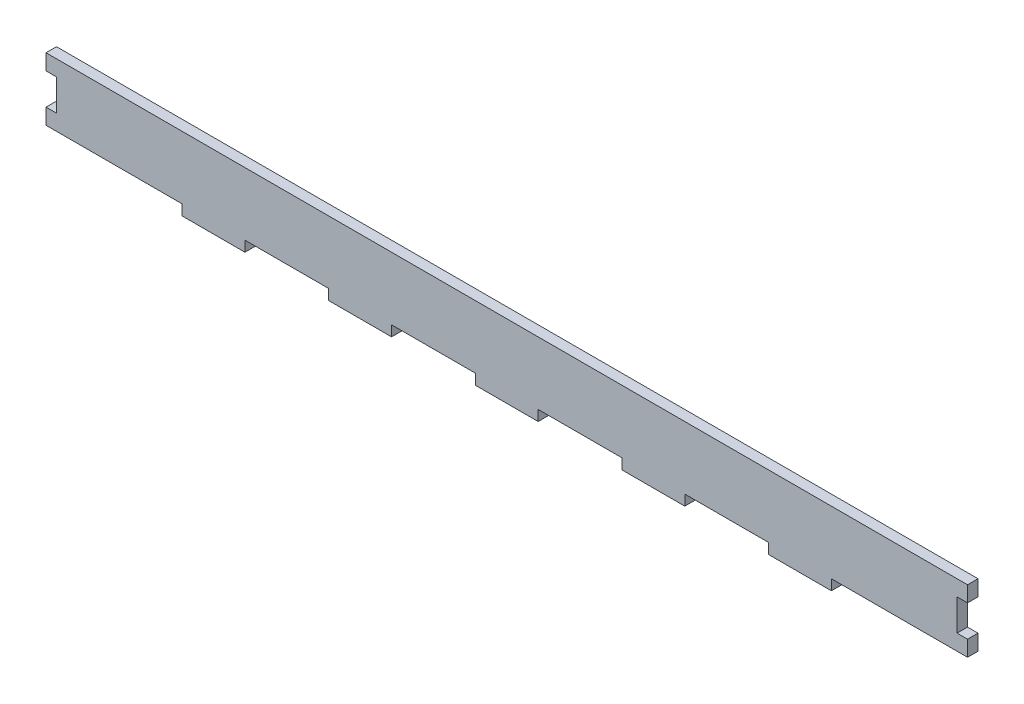
ISO-10303-21;
HEADER;
FILE_DESCRIPTION(('STEP AP214'),'2;1');
FILE_NAME('part.step','',(''),(''),'','','');
FILE_SCHEMA(('AUTOMOTIVE_DESIGN { 1 0 10303 214 1 1 1 1 }'));
ENDSEC;
DATA;
#1=APPLICATION_CONTEXT('core data for automotive mechanical design processes');
#2=APPLICATION_PROTOCOL_DEFINITION('international standard','automotive_design',2000,#1);
#3=PRODUCT_CONTEXT('',#1,'mechanical');
#4=PRODUCT('Part','Part','',(#3));
#5=PRODUCT_RELATED_PRODUCT_CATEGORY('part','',(#4));
#6=PRODUCT_DEFINITION_FORMATION('','',#4);
#7=PRODUCT_DEFINITION_CONTEXT('part definition',#1,'design');
#8=PRODUCT_DEFINITION('design','',#6,#7);
#9=PRODUCT_DEFINITION_SHAPE('','',#8);
#10=(LENGTH_UNIT() NAMED_UNIT(*) SI_UNIT(.MILLI.,.METRE.));
#11=(NAMED_UNIT(*) PLANE_ANGLE_UNIT() SI_UNIT($,.RADIAN.));
#12=(NAMED_UNIT(*) SI_UNIT($,.STERADIAN.) SOLID_ANGLE_UNIT());
#13=UNCERTAINTY_MEASURE_WITH_UNIT(LENGTH_MEASURE(1.E-05),#10,'distance_accuracy_value','');
#14=(GEOMETRIC_REPRESENTATION_CONTEXT(3) GLOBAL_UNCERTAINTY_ASSIGNED_CONTEXT((#13)) GLOBAL_UNIT_ASSIGNED_CONTEXT((#10,
#11,#12)) REPRESENTATION_CONTEXT('',''));
#15=CARTESIAN_POINT('',(0.,0.,0.));
#16=DIRECTION('',(0.,0.,1.));
#17=DIRECTION('',(1.,0.,0.));
#18=AXIS2_PLACEMENT_3D('',#15,#16,#17);
#19=CARTESIAN_POINT('',(9.99972860464549,0.,-5.));
#20=DIRECTION('',(1.,0.,0.));
#21=DIRECTION('',(0.,0.,-1.));
#22=AXIS2_PLACEMENT_3D('',#19,#20,#21);
#23=PLANE('',#22);
#24=DIRECTION('',(0.,1.,0.));
#25=VECTOR('',#24,1.);
#26=CARTESIAN_POINT('',(9.99972860464549,0.,0.));
#27=LINE('',#26,#25);
#28=CARTESIAN_POINT('',(9.99972860464549,-422.500000000006,0.));
#29=VERTEX_POINT('',#28);
#30=CARTESIAN_POINT('',(9.99972860464549,-407.500000000006,0.));
#31=VERTEX_POINT('',#30);
#32=EDGE_CURVE('E277',#29,#31,#27,.T.);
#33=ORIENTED_EDGE('',*,*,#32,.T.);
#34=DIRECTION('',(0.,0.,1.));
#35=VECTOR('',#34,1.);
#36=CARTESIAN_POINT('',(9.99972860464549,-407.500000000006,-5.));
#37=LINE('',#36,#35);
#38=CARTESIAN_POINT('',(9.99972860464549,-407.500000000006,-5.));
#39=VERTEX_POINT('',#38);
#40=EDGE_CURVE('E11',#39,#31,#37,.T.);
#41=ORIENTED_EDGE('',*,*,#40,.F.);
#42=DIRECTION('',(0.,1.,0.));
#43=VECTOR('',#42,1.);
#44=CARTESIAN_POINT('',(9.99972860464549,0.,-5.));
#45=LINE('',#44,#43);
#46=CARTESIAN_POINT('',(9.99972860464549,-422.500000000006,-5.));
#47=VERTEX_POINT('',#46);
#48=EDGE_CURVE('E354',#47,#39,#45,.T.);
#49=ORIENTED_EDGE('',*,*,#48,.F.);
#50=DIRECTION('',(0.,0.,1.));
#51=VECTOR('',#50,1.);
#52=CARTESIAN_POINT('',(9.99972860464549,-422.500000000006,-5.));
#53=LINE('',#52,#51);
#54=EDGE_CURVE('E42',#47,#29,#53,.T.);
#55=ORIENTED_EDGE('',*,*,#54,.T.);
#56=EDGE_LOOP('',(#33,#41,#49,#55));
#57=FACE_BOUND('',#56,.T.);
#58=ADVANCED_FACE('F39',(#57),#23,.F.);
#59=CARTESIAN_POINT('',(4.52440440576956E-12,-407.500000000006,-5.));
#60=DIRECTION('',(0.,1.,0.));
#61=DIRECTION('',(-1.,0.,0.));
#62=AXIS2_PLACEMENT_3D('',#59,#60,#61);
#63=PLANE('',#62);
#64=DIRECTION('',(-1.,0.,0.));
#65=VECTOR('',#64,1.);
#66=CARTESIAN_POINT('',(4.52440440576956E-12,-407.500000000006,0.));
#67=LINE('',#66,#65);
#68=CARTESIAN_POINT('',(4.99999999994966,-407.500000000006,0.));
#69=VERTEX_POINT('',#68);
#70=EDGE_CURVE('E162',#31,#69,#67,.T.);
#71=ORIENTED_EDGE('',*,*,#70,.T.);
#72=DIRECTION('',(0.,0.,1.));
#73=VECTOR('',#72,1.);
#74=CARTESIAN_POINT('',(4.99999999994966,-407.500000000006,-5.));
#75=LINE('',#74,#73);
#76=CARTESIAN_POINT('',(4.99999999994966,-407.500000000006,-5.));
#77=VERTEX_POINT('',#76);
#78=EDGE_CURVE('E48',#77,#69,#75,.T.);
#79=ORIENTED_EDGE('',*,*,#78,.F.);
#80=DIRECTION('',(-1.,0.,0.));
#81=VECTOR('',#80,1.);
#82=CARTESIAN_POINT('',(4.52440440576956E-12,-407.500000000006,-5.));
#83=LINE('',#82,#81);
#84=EDGE_CURVE('E56',#39,#77,#83,.T.);
#85=ORIENTED_EDGE('',*,*,#84,.F.);
#86=ORIENTED_EDGE('',*,*,#40,.T.);
#87=EDGE_LOOP('',(#71,#79,#85,#86));
#88=FACE_BOUND('',#87,.T.);
#89=ADVANCED_FACE('F441',(#88),#63,.F.);
#90=CARTESIAN_POINT('',(4.99999999994966,0.,-5.));
#91=DIRECTION('',(-1.,0.,0.));
#92=DIRECTION('',(0.,0.,1.));
#93=AXIS2_PLACEMENT_3D('',#90,#91,#92);
#94=PLANE('',#93);
#95=DIRECTION('',(0.,-1.,0.));
#96=VECTOR('',#95,1.);
#97=CARTESIAN_POINT('',(4.99999999994966,0.,0.));
#98=LINE('',#97,#96);
#99=CARTESIAN_POINT('',(4.99999999994966,-400.000000000006,0.));
#100=VERTEX_POINT('',#99);
#101=EDGE_CURVE('E259',#100,#69,#98,.T.);
#102=ORIENTED_EDGE('',*,*,#101,.F.);
#103=DIRECTION('',(0.,0.,1.));
#104=VECTOR('',#103,1.);
#105=CARTESIAN_POINT('',(4.99999999994966,-400.000000000006,-5.));
#106=LINE('',#105,#104);
#107=CARTESIAN_POINT('',(4.99999999994966,-400.000000000006,-5.));
#108=VERTEX_POINT('',#107);
#109=EDGE_CURVE('E254',#108,#100,#106,.T.);
#110=ORIENTED_EDGE('',*,*,#109,.F.);
#111=DIRECTION('',(0.,-1.,0.));
#112=VECTOR('',#111,1.);
#113=CARTESIAN_POINT('',(4.99999999994966,0.,-5.));
#114=LINE('',#113,#112);
#115=EDGE_CURVE('E258',#108,#77,#114,.T.);
#116=ORIENTED_EDGE('',*,*,#115,.T.);
#117=ORIENTED_EDGE('',*,*,#78,.T.);
#118=EDGE_LOOP('',(#102,#110,#116,#117));
#119=FACE_BOUND('',#118,.T.);
#120=ADVANCED_FACE('F256',(#119),#94,.T.);
#121=CARTESIAN_POINT('',(0.,-400.000000000006,-5.));
#122=DIRECTION('',(0.,-1.,0.));
#123=DIRECTION('',(0.,0.,-1.));
#124=AXIS2_PLACEMENT_3D('',#121,#122,#123);
#125=PLANE('',#124);
#126=DIRECTION('',(1.,0.,0.));
#127=VECTOR('',#126,1.);
#128=CARTESIAN_POINT('',(0.,-400.000000000006,0.));
#129=LINE('',#128,#127);
#130=CARTESIAN_POINT('',(445.00000000005,-400.000000000006,0.));
#131=VERTEX_POINT('',#130);
#132=EDGE_CURVE('E351',#100,#131,#129,.T.);
#133=ORIENTED_EDGE('',*,*,#132,.T.);
#134=DIRECTION('',(0.,0.,1.));
#135=VECTOR('',#134,1.);
#136=CARTESIAN_POINT('',(445.00000000005,-400.000000000006,-5.));
#137=LINE('',#136,#135);
#138=CARTESIAN_POINT('',(445.00000000005,-400.000000000006,-5.));
#139=VERTEX_POINT('',#138);
#140=EDGE_CURVE('E262',#139,#131,#137,.T.);
#141=ORIENTED_EDGE('',*,*,#140,.F.);
#142=DIRECTION('',(1.,0.,0.));
#143=VECTOR('',#142,1.);
#144=CARTESIAN_POINT('',(0.,-400.000000000006,-5.));
#145=LINE('',#144,#143);
#146=EDGE_CURVE('E265',#108,#139,#145,.T.);
#147=ORIENTED_EDGE('',*,*,#146,.F.);
#148=ORIENTED_EDGE('',*,*,#109,.T.);
#149=EDGE_LOOP('',(#133,#141,#147,#148));
#150=FACE_BOUND('',#149,.T.);
#151=ADVANCED_FACE('F266',(#150),#125,.F.);
#152=CARTESIAN_POINT('',(445.000000000044,6.58732327944329E-12,-5.));
#153=DIRECTION('',(-1.,0.,0.));
#154=DIRECTION('',(0.,-1.,0.));
#155=AXIS2_PLACEMENT_3D('',#152,#153,#154);
#156=PLANE('',#155);
#157=DIRECTION('',(0.,-1.,0.));
#158=VECTOR('',#157,1.);
#159=CARTESIAN_POINT('',(445.000000000044,6.58732327944329E-12,0.));
#160=LINE('',#159,#158);
#161=CARTESIAN_POINT('',(445.00000000005,-407.500000000006,0.));
#162=VERTEX_POINT('',#161);
#163=EDGE_CURVE('E348',#131,#162,#160,.T.);
#164=ORIENTED_EDGE('',*,*,#163,.T.);
#165=DIRECTION('',(0.,0.,1.));
#166=VECTOR('',#165,1.);
#167=CARTESIAN_POINT('',(445.00000000005,-407.500000000006,-5.));
#168=LINE('',#167,#166);
#169=CARTESIAN_POINT('',(445.00000000005,-407.500000000006,-5.));
#170=VERTEX_POINT('',#169);
#171=EDGE_CURVE('E358',#170,#162,#168,.T.);
#172=ORIENTED_EDGE('',*,*,#171,.F.);
#173=DIRECTION('',(0.,-1.,0.));
#174=VECTOR('',#173,1.);
#175=CARTESIAN_POINT('',(445.000000000044,6.58732327944329E-12,-5.));
#176=LINE('',#175,#174);
#177=EDGE_CURVE('E270',#139,#170,#176,.T.);
#178=ORIENTED_EDGE('',*,*,#177,.F.);
#179=ORIENTED_EDGE('',*,*,#140,.T.);
#180=EDGE_LOOP('',(#164,#172,#178,#179));
#181=FACE_BOUND('',#180,.T.);
#182=ADVANCED_FACE('F454',(#181),#156,.F.);
#183=CARTESIAN_POINT('',(-4.5244044057695E-12,-407.500000000001,-5.));
#184=DIRECTION('',(0.,-1.,0.));
#185=DIRECTION('',(1.,0.,0.));
#186=AXIS2_PLACEMENT_3D('',#183,#184,#185);
#187=PLANE('',#186);
#188=DIRECTION('',(1.,0.,0.));
#189=VECTOR('',#188,1.);
#190=CARTESIAN_POINT('',(-4.5244044057695E-12,-407.500000000001,0.));
#191=LINE('',#190,#189);
#192=CARTESIAN_POINT('',(440.000271395355,-407.500000000006,0.));
#193=VERTEX_POINT('',#192);
#194=EDGE_CURVE('E345',#193,#162,#191,.T.);
#195=ORIENTED_EDGE('',*,*,#194,.F.);
#196=DIRECTION('',(0.,0.,1.));
#197=VECTOR('',#196,1.);
#198=CARTESIAN_POINT('',(440.000271395355,-407.500000000006,-5.));
#199=LINE('',#198,#197);
#200=CARTESIAN_POINT('',(440.000271395355,-407.500000000006,-5.));
#201=VERTEX_POINT('',#200);
#202=EDGE_CURVE('E360',#201,#193,#199,.T.);
#203=ORIENTED_EDGE('',*,*,#202,.F.);
#204=DIRECTION('',(1.,0.,0.));
#205=VECTOR('',#204,1.);
#206=CARTESIAN_POINT('',(-4.5244044057695E-12,-407.500000000001,-5.));
#207=LINE('',#206,#205);
#208=EDGE_CURVE('E623',#201,#170,#207,.T.);
#209=ORIENTED_EDGE('',*,*,#208,.T.);
#210=ORIENTED_EDGE('',*,*,#171,.T.);
#211=EDGE_LOOP('',(#195,#203,#209,#210));
#212=FACE_BOUND('',#211,.T.);
#213=ADVANCED_FACE('F457',(#212),#187,.T.);
#214=CARTESIAN_POINT('',(440.000271395355,0.,-5.));
#215=DIRECTION('',(1.,0.,0.));
#216=DIRECTION('',(0.,0.,-1.));
#217=AXIS2_PLACEMENT_3D('',#214,#215,#216);
#218=PLANE('',#217);
#219=DIRECTION('',(0.,1.,0.));
#220=VECTOR('',#219,1.);
#221=CARTESIAN_POINT('',(440.000271395355,0.,0.));
#222=LINE('',#221,#220);
#223=CARTESIAN_POINT('',(440.000271395355,-422.500000000006,0.));
#224=VERTEX_POINT('',#223);
#225=EDGE_CURVE('E342',#224,#193,#222,.T.);
#226=ORIENTED_EDGE('',*,*,#225,.F.);
#227=DIRECTION('',(0.,0.,1.));
#228=VECTOR('',#227,1.);
#229=CARTESIAN_POINT('',(440.000271395355,-422.500000000006,-5.));
#230=LINE('',#229,#228);
#231=CARTESIAN_POINT('',(440.000271395355,-422.500000000006,-5.));
#232=VERTEX_POINT('',#231);
#233=EDGE_CURVE('E362',#232,#224,#230,.T.);
#234=ORIENTED_EDGE('',*,*,#233,.F.);
#235=DIRECTION('',(0.,1.,0.));
#236=VECTOR('',#235,1.);
#237=CARTESIAN_POINT('',(440.000271395355,0.,-5.));
#238=LINE('',#237,#236);
#239=EDGE_CURVE('E620',#232,#201,#238,.T.);
#240=ORIENTED_EDGE('',*,*,#239,.T.);
#241=ORIENTED_EDGE('',*,*,#202,.T.);
#242=EDGE_LOOP('',(#226,#234,#240,#241));
#243=FACE_BOUND('',#242,.T.);
#244=ADVANCED_FACE('F461',(#243),#218,.T.);
#245=CARTESIAN_POINT('',(0.,-422.500000000006,-5.));
#246=DIRECTION('',(0.,-1.,0.));
#247=DIRECTION('',(0.,0.,-1.));
#248=AXIS2_PLACEMENT_3D('',#245,#246,#247);
#249=PLANE('',#248);
#250=DIRECTION('',(1.,0.,0.));
#251=VECTOR('',#250,1.);
#252=CARTESIAN_POINT('',(0.,-422.500000000006,0.));
#253=LINE('',#252,#251);
#254=CARTESIAN_POINT('',(445.00000000005,-422.500000000006,0.));
#255=VERTEX_POINT('',#254);
#256=EDGE_CURVE('E340',#224,#255,#253,.T.);
#257=ORIENTED_EDGE('',*,*,#256,.T.);
#258=DIRECTION('',(0.,0.,1.));
#259=VECTOR('',#258,1.);
#260=CARTESIAN_POINT('',(445.00000000005,-422.500000000006,-5.));
#261=LINE('',#260,#259);
#262=CARTESIAN_POINT('',(445.00000000005,-422.500000000006,-5.));
#263=VERTEX_POINT('',#262);
#264=EDGE_CURVE('E364',#263,#255,#261,.T.);
#265=ORIENTED_EDGE('',*,*,#264,.F.);
#266=DIRECTION('',(1.,0.,0.));
#267=VECTOR('',#266,1.);
#268=CARTESIAN_POINT('',(0.,-422.500000000006,-5.));
#269=LINE('',#268,#267);
#270=EDGE_CURVE('E618',#232,#263,#269,.T.);
#271=ORIENTED_EDGE('',*,*,#270,.F.);
#272=ORIENTED_EDGE('',*,*,#233,.T.);
#273=EDGE_LOOP('',(#257,#265,#271,#272));
#274=FACE_BOUND('',#273,.T.);
#275=ADVANCED_FACE('F465',(#274),#249,.F.);
#276=CARTESIAN_POINT('',(445.000000000025,2.63492931177836E-11,-5.));
#277=DIRECTION('',(-1.,0.,0.));
#278=DIRECTION('',(0.,-1.,0.));
#279=AXIS2_PLACEMENT_3D('',#276,#277,#278);
#280=PLANE('',#279);
#281=DIRECTION('',(0.,-1.,0.));
#282=VECTOR('',#281,1.);
#283=CARTESIAN_POINT('',(445.000000000025,2.63492931177836E-11,0.));
#284=LINE('',#283,#282);
#285=CARTESIAN_POINT('',(445.000000000051,-430.000000000002,0.));
#286=VERTEX_POINT('',#285);
#287=EDGE_CURVE('E338',#255,#286,#284,.T.);
#288=ORIENTED_EDGE('',*,*,#287,.T.);
#289=DIRECTION('',(0.,0.,1.));
#290=VECTOR('',#289,1.);
#291=CARTESIAN_POINT('',(445.000000000051,-430.000000000002,-5.));
#292=LINE('',#291,#290);
#293=CARTESIAN_POINT('',(445.000000000051,-430.000000000002,-5.));
#294=VERTEX_POINT('',#293);
#295=EDGE_CURVE('E367',#294,#286,#292,.T.);
#296=ORIENTED_EDGE('',*,*,#295,.F.);
#297=DIRECTION('',(0.,-1.,0.));
#298=VECTOR('',#297,1.);
#299=CARTESIAN_POINT('',(445.000000000025,2.63492931177836E-11,-5.));
#300=LINE('',#299,#298);
#301=EDGE_CURVE('E616',#263,#294,#300,.T.);
#302=ORIENTED_EDGE('',*,*,#301,.F.);
#303=ORIENTED_EDGE('',*,*,#264,.T.);
#304=EDGE_LOOP('',(#288,#296,#302,#303));
#305=FACE_BOUND('',#304,.T.);
#306=ADVANCED_FACE('F469',(#305),#280,.F.);
#307=CARTESIAN_POINT('',(0.,-430.000000000006,-5.));
#308=DIRECTION('',(0.,1.,0.));
#309=DIRECTION('',(0.,0.,1.));
#310=AXIS2_PLACEMENT_3D('',#307,#308,#309);
#311=PLANE('',#310);
#312=DIRECTION('',(-1.,0.,0.));
#313=VECTOR('',#312,1.);
#314=CARTESIAN_POINT('',(0.,-430.000000000006,0.));
#315=LINE('',#314,#313);
#316=CARTESIAN_POINT('',(380.,-430.000000000006,0.));
#317=VERTEX_POINT('',#316);
#318=EDGE_CURVE('E336',#286,#317,#315,.T.);
#319=ORIENTED_EDGE('',*,*,#318,.T.);
#320=DIRECTION('',(0.,0.,1.));
#321=VECTOR('',#320,1.);
#322=CARTESIAN_POINT('',(380.,-430.000000000006,-5.));
#323=LINE('',#322,#321);
#324=CARTESIAN_POINT('',(380.,-430.000000000006,-5.));
#325=VERTEX_POINT('',#324);
#326=EDGE_CURVE('E370',#325,#317,#323,.T.);
#327=ORIENTED_EDGE('',*,*,#326,.F.);
#328=DIRECTION('',(-1.,0.,0.));
#329=VECTOR('',#328,1.);
#330=CARTESIAN_POINT('',(0.,-430.000000000006,-5.));
#331=LINE('',#330,#329);
#332=EDGE_CURVE('E614',#294,#325,#331,.T.);
#333=ORIENTED_EDGE('',*,*,#332,.F.);
#334=ORIENTED_EDGE('',*,*,#295,.T.);
#335=EDGE_LOOP('',(#319,#327,#333,#334));
#336=FACE_BOUND('',#335,.T.);
#337=ADVANCED_FACE('F473',(#336),#311,.F.);
#338=CARTESIAN_POINT('',(380.,0.,-5.));
#339=DIRECTION('',(-1.,0.,0.));
#340=DIRECTION('',(0.,0.,1.));
#341=AXIS2_PLACEMENT_3D('',#338,#339,#340);
#342=PLANE('',#341);
#343=DIRECTION('',(0.,-1.,0.));
#344=VECTOR('',#343,1.);
#345=CARTESIAN_POINT('',(380.,0.,0.));
#346=LINE('',#345,#344);
#347=CARTESIAN_POINT('',(380.,-435.,0.));
#348=VERTEX_POINT('',#347);
#349=EDGE_CURVE('E334',#317,#348,#346,.T.);
#350=ORIENTED_EDGE('',*,*,#349,.T.);
#351=DIRECTION('',(0.,0.,1.));
#352=VECTOR('',#351,1.);
#353=CARTESIAN_POINT('',(380.,-435.,-5.));
#354=LINE('',#353,#352);
#355=CARTESIAN_POINT('',(380.,-435.,-5.));
#356=VERTEX_POINT('',#355);
#357=EDGE_CURVE('E373',#356,#348,#354,.T.);
#358=ORIENTED_EDGE('',*,*,#357,.F.);
#359=DIRECTION('',(0.,-1.,0.));
#360=VECTOR('',#359,1.);
#361=CARTESIAN_POINT('',(380.,0.,-5.));
#362=LINE('',#361,#360);
#363=EDGE_CURVE('E612',#325,#356,#362,.T.);
#364=ORIENTED_EDGE('',*,*,#363,.F.);
#365=ORIENTED_EDGE('',*,*,#326,.T.);
#366=EDGE_LOOP('',(#350,#358,#364,#365));
#367=FACE_BOUND('',#366,.T.);
#368=ADVANCED_FACE('F477',(#367),#342,.F.);
#369=CARTESIAN_POINT('',(1.60982338570648E-12,-435.000000000001,-5.));
#370=DIRECTION('',(0.,1.,0.));
#371=DIRECTION('',(-1.,0.,0.));
#372=AXIS2_PLACEMENT_3D('',#369,#370,#371);
#373=PLANE('',#372);
#374=DIRECTION('',(-1.,0.,0.));
#375=VECTOR('',#374,1.);
#376=CARTESIAN_POINT('',(1.60982338570648E-12,-435.000000000001,0.));
#377=LINE('',#376,#375);
#378=CARTESIAN_POINT('',(350.,-435.,0.));
#379=VERTEX_POINT('',#378);
#380=EDGE_CURVE('E331',#348,#379,#377,.T.);
#381=ORIENTED_EDGE('',*,*,#380,.T.);
#382=DIRECTION('',(0.,0.,1.));
#383=VECTOR('',#382,1.);
#384=CARTESIAN_POINT('',(350.,-435.,-5.));
#385=LINE('',#384,#383);
#386=CARTESIAN_POINT('',(350.,-435.,-5.));
#387=VERTEX_POINT('',#386);
#388=EDGE_CURVE('E376',#387,#379,#385,.T.);
#389=ORIENTED_EDGE('',*,*,#388,.F.);
#390=DIRECTION('',(-1.,0.,0.));
#391=VECTOR('',#390,1.);
#392=CARTESIAN_POINT('',(1.60982338570648E-12,-435.000000000001,-5.));
#393=LINE('',#392,#391);
#394=EDGE_CURVE('E610',#356,#387,#393,.T.);
#395=ORIENTED_EDGE('',*,*,#394,.F.);
#396=ORIENTED_EDGE('',*,*,#357,.T.);
#397=EDGE_LOOP('',(#381,#389,#395,#396));
#398=FACE_BOUND('',#397,.T.);
#399=ADVANCED_FACE('F481',(#398),#373,.F.);
#400=CARTESIAN_POINT('',(350.,0.,-5.));
#401=DIRECTION('',(-1.,0.,0.));
#402=DIRECTION('',(0.,0.,1.));
#403=AXIS2_PLACEMENT_3D('',#400,#401,#402);
#404=PLANE('',#403);
#405=DIRECTION('',(0.,-1.,0.));
#406=VECTOR('',#405,1.);
#407=CARTESIAN_POINT('',(350.,0.,0.));
#408=LINE('',#407,#406);
#409=CARTESIAN_POINT('',(350.,-430.000000000006,0.));
#410=VERTEX_POINT('',#409);
#411=EDGE_CURVE('E328',#410,#379,#408,.T.);
#412=ORIENTED_EDGE('',*,*,#411,.F.);
#413=DIRECTION('',(0.,0.,1.));
#414=VECTOR('',#413,1.);
#415=CARTESIAN_POINT('',(350.,-430.000000000006,-5.));
#416=LINE('',#415,#414);
#417=CARTESIAN_POINT('',(350.,-430.000000000006,-5.));
#418=VERTEX_POINT('',#417);
#419=EDGE_CURVE('E378',#418,#410,#416,.T.);
#420=ORIENTED_EDGE('',*,*,#419,.F.);
#421=DIRECTION('',(0.,-1.,0.));
#422=VECTOR('',#421,1.);
#423=CARTESIAN_POINT('',(350.,0.,-5.));
#424=LINE('',#423,#422);
#425=EDGE_CURVE('E607',#418,#387,#424,.T.);
#426=ORIENTED_EDGE('',*,*,#425,.T.);
#427=ORIENTED_EDGE('',*,*,#388,.T.);
#428=EDGE_LOOP('',(#412,#420,#426,#427));
#429=FACE_BOUND('',#428,.T.);
#430=ADVANCED_FACE('F485',(#429),#404,.T.);
#431=CARTESIAN_POINT('',(-5.96744875736029E-13,-430.000000000005,-5.));
#432=DIRECTION('',(0.,1.,0.));
#433=DIRECTION('',(-1.,0.,0.));
#434=AXIS2_PLACEMENT_3D('',#431,#432,#433);
#435=PLANE('',#434);
#436=DIRECTION('',(-1.,0.,0.));
#437=VECTOR('',#436,1.);
#438=CARTESIAN_POINT('',(-5.96744875736029E-13,-430.000000000005,0.));
#439=LINE('',#438,#437);
#440=CARTESIAN_POINT('',(310.,-430.000000000006,0.));
#441=VERTEX_POINT('',#440);
#442=EDGE_CURVE('E326',#410,#441,#439,.T.);
#443=ORIENTED_EDGE('',*,*,#442,.T.);
#444=DIRECTION('',(0.,0.,1.));
#445=VECTOR('',#444,1.);
#446=CARTESIAN_POINT('',(310.,-430.000000000006,-5.));
#447=LINE('',#446,#445);
#448=CARTESIAN_POINT('',(310.,-430.000000000006,-5.));
#449=VERTEX_POINT('',#448);
#450=EDGE_CURVE('E380',#449,#441,#447,.T.);
#451=ORIENTED_EDGE('',*,*,#450,.F.);
#452=DIRECTION('',(-1.,0.,0.));
#453=VECTOR('',#452,1.);
#454=CARTESIAN_POINT('',(-5.96744875736029E-13,-430.000000000005,-5.));
#455=LINE('',#454,#453);
#456=EDGE_CURVE('E605',#418,#449,#455,.T.);
#457=ORIENTED_EDGE('',*,*,#456,.F.);
#458=ORIENTED_EDGE('',*,*,#419,.T.);
#459=EDGE_LOOP('',(#443,#451,#457,#458));
#460=FACE_BOUND('',#459,.T.);
#461=ADVANCED_FACE('F489',(#460),#435,.F.);
#462=CARTESIAN_POINT('',(310.,0.,-5.));
#463=DIRECTION('',(-1.,0.,0.));
#464=DIRECTION('',(0.,0.,1.));
#465=AXIS2_PLACEMENT_3D('',#462,#463,#464);
#466=PLANE('',#465);
#467=DIRECTION('',(0.,-1.,0.));
#468=VECTOR('',#467,1.);
#469=CARTESIAN_POINT('',(310.,0.,0.));
#470=LINE('',#469,#468);
#471=CARTESIAN_POINT('',(310.,-435.,0.));
#472=VERTEX_POINT('',#471);
#473=EDGE_CURVE('E324',#441,#472,#470,.T.);
#474=ORIENTED_EDGE('',*,*,#473,.T.);
#475=DIRECTION('',(0.,0.,1.));
#476=VECTOR('',#475,1.);
#477=CARTESIAN_POINT('',(310.,-435.,-5.));
#478=LINE('',#477,#476);
#479=CARTESIAN_POINT('',(310.,-435.,-5.));
#480=VERTEX_POINT('',#479);
#481=EDGE_CURVE('E383',#480,#472,#478,.T.);
#482=ORIENTED_EDGE('',*,*,#481,.F.);
#483=DIRECTION('',(0.,-1.,0.));
#484=VECTOR('',#483,1.);
#485=CARTESIAN_POINT('',(310.,0.,-5.));
#486=LINE('',#485,#484);
#487=EDGE_CURVE('E603',#449,#480,#486,.T.);
#488=ORIENTED_EDGE('',*,*,#487,.F.);
#489=ORIENTED_EDGE('',*,*,#450,.T.);
#490=EDGE_LOOP('',(#474,#482,#488,#489));
#491=FACE_BOUND('',#490,.T.);
#492=ADVANCED_FACE('F493',(#491),#466,.F.);
#493=CARTESIAN_POINT('',(1.60982338570648E-12,-435.000000000001,-5.));
#494=DIRECTION('',(0.,1.,0.));
#495=DIRECTION('',(-1.,0.,0.));
#496=AXIS2_PLACEMENT_3D('',#493,#494,#495);
#497=PLANE('',#496);
#498=DIRECTION('',(-1.,0.,0.));
#499=VECTOR('',#498,1.);
#500=CARTESIAN_POINT('',(1.60982338570648E-12,-435.000000000001,0.));
#501=LINE('',#500,#499);
#502=CARTESIAN_POINT('',(280.,-435.,0.));
#503=VERTEX_POINT('',#502);
#504=EDGE_CURVE('E321',#472,#503,#501,.T.);
#505=ORIENTED_EDGE('',*,*,#504,.T.);
#506=DIRECTION('',(0.,0.,1.));
#507=VECTOR('',#506,1.);
#508=CARTESIAN_POINT('',(280.,-435.,-5.));
#509=LINE('',#508,#507);
#510=CARTESIAN_POINT('',(280.,-435.,-5.));
#511=VERTEX_POINT('',#510);
#512=EDGE_CURVE('E386',#511,#503,#509,.T.);
#513=ORIENTED_EDGE('',*,*,#512,.F.);
#514=DIRECTION('',(-1.,0.,0.));
#515=VECTOR('',#514,1.);
#516=CARTESIAN_POINT('',(1.60982338570648E-12,-435.000000000001,-5.));
#517=LINE('',#516,#515);
#518=EDGE_CURVE('E601',#480,#511,#517,.T.);
#519=ORIENTED_EDGE('',*,*,#518,.F.);
#520=ORIENTED_EDGE('',*,*,#481,.T.);
#521=EDGE_LOOP('',(#505,#513,#519,#520));
#522=FACE_BOUND('',#521,.T.);
#523=ADVANCED_FACE('F497',(#522),#497,.F.);
#524=CARTESIAN_POINT('',(280.,0.,-5.));
#525=DIRECTION('',(-1.,0.,0.));
#526=DIRECTION('',(0.,0.,1.));
#527=AXIS2_PLACEMENT_3D('',#524,#525,#526);
#528=PLANE('',#527);
#529=DIRECTION('',(0.,-1.,0.));
#530=VECTOR('',#529,1.);
#531=CARTESIAN_POINT('',(280.,0.,0.));
#532=LINE('',#531,#530);
#533=CARTESIAN_POINT('',(280.,-430.000000000006,0.));
#534=VERTEX_POINT('',#533);
#535=EDGE_CURVE('E318',#534,#503,#532,.T.);
#536=ORIENTED_EDGE('',*,*,#535,.F.);
#537=DIRECTION('',(0.,0.,1.));
#538=VECTOR('',#537,1.);
#539=CARTESIAN_POINT('',(280.,-430.000000000006,-5.));
#540=LINE('',#539,#538);
#541=CARTESIAN_POINT('',(280.,-430.000000000006,-5.));
#542=VERTEX_POINT('',#541);
#543=EDGE_CURVE('E388',#542,#534,#540,.T.);
#544=ORIENTED_EDGE('',*,*,#543,.F.);
#545=DIRECTION('',(0.,-1.,0.));
#546=VECTOR('',#545,1.);
#547=CARTESIAN_POINT('',(280.,0.,-5.));
#548=LINE('',#547,#546);
#549=EDGE_CURVE('E598',#542,#511,#548,.T.);
#550=ORIENTED_EDGE('',*,*,#549,.T.);
#551=ORIENTED_EDGE('',*,*,#512,.T.);
#552=EDGE_LOOP('',(#536,#544,#550,#551));
#553=FACE_BOUND('',#552,.T.);
#554=ADVANCED_FACE('F501',(#553),#528,.T.);
#555=CARTESIAN_POINT('',(-5.96744875736029E-13,-430.000000000005,-5.));
#556=DIRECTION('',(0.,1.,0.));
#557=DIRECTION('',(-1.,0.,0.));
#558=AXIS2_PLACEMENT_3D('',#555,#556,#557);
#559=PLANE('',#558);
#560=DIRECTION('',(-1.,0.,0.));
#561=VECTOR('',#560,1.);
#562=CARTESIAN_POINT('',(-5.96744875736029E-13,-430.000000000005,0.));
#563=LINE('',#562,#561);
#564=CARTESIAN_POINT('',(240.,-430.000000000006,0.));
#565=VERTEX_POINT('',#564);
#566=EDGE_CURVE('E316',#534,#565,#563,.T.);
#567=ORIENTED_EDGE('',*,*,#566,.T.);
#568=DIRECTION('',(0.,0.,1.));
#569=VECTOR('',#568,1.);
#570=CARTESIAN_POINT('',(240.,-430.000000000006,-5.));
#571=LINE('',#570,#569);
#572=CARTESIAN_POINT('',(240.,-430.000000000006,-5.));
#573=VERTEX_POINT('',#572);
#574=EDGE_CURVE('E390',#573,#565,#571,.T.);
#575=ORIENTED_EDGE('',*,*,#574,.F.);
#576=DIRECTION('',(-1.,0.,0.));
#577=VECTOR('',#576,1.);
#578=CARTESIAN_POINT('',(-5.96744875736029E-13,-430.000000000005,-5.));
#579=LINE('',#578,#577);
#580=EDGE_CURVE('E596',#542,#573,#579,.T.);
#581=ORIENTED_EDGE('',*,*,#580,.F.);
#582=ORIENTED_EDGE('',*,*,#543,.T.);
#583=EDGE_LOOP('',(#567,#575,#581,#582));
#584=FACE_BOUND('',#583,.T.);
#585=ADVANCED_FACE('F505',(#584),#559,.F.);
#586=CARTESIAN_POINT('',(240.,0.,-5.));
#587=DIRECTION('',(-1.,0.,0.));
#588=DIRECTION('',(0.,0.,1.));
#589=AXIS2_PLACEMENT_3D('',#586,#587,#588);
#590=PLANE('',#589);
#591=DIRECTION('',(0.,-1.,0.));
#592=VECTOR('',#591,1.);
#593=CARTESIAN_POINT('',(240.,0.,0.));
#594=LINE('',#593,#592);
#595=CARTESIAN_POINT('',(240.,-435.,0.));
#596=VERTEX_POINT('',#595);
#597=EDGE_CURVE('E314',#565,#596,#594,.T.);
#598=ORIENTED_EDGE('',*,*,#597,.T.);
#599=DIRECTION('',(0.,0.,1.));
#600=VECTOR('',#599,1.);
#601=CARTESIAN_POINT('',(240.,-435.,-5.));
#602=LINE('',#601,#600);
#603=CARTESIAN_POINT('',(240.,-435.,-5.));
#604=VERTEX_POINT('',#603);
#605=EDGE_CURVE('E393',#604,#596,#602,.T.);
#606=ORIENTED_EDGE('',*,*,#605,.F.);
#607=DIRECTION('',(0.,-1.,0.));
#608=VECTOR('',#607,1.);
#609=CARTESIAN_POINT('',(240.,0.,-5.));
#610=LINE('',#609,#608);
#611=EDGE_CURVE('E594',#573,#604,#610,.T.);
#612=ORIENTED_EDGE('',*,*,#611,.F.);
#613=ORIENTED_EDGE('',*,*,#574,.T.);
#614=EDGE_LOOP('',(#598,#606,#612,#613));
#615=FACE_BOUND('',#614,.T.);
#616=ADVANCED_FACE('F509',(#615),#590,.F.);
#617=CARTESIAN_POINT('',(1.60982338570648E-12,-435.000000000001,-5.));
#618=DIRECTION('',(0.,1.,0.));
#619=DIRECTION('',(-1.,0.,0.));
#620=AXIS2_PLACEMENT_3D('',#617,#618,#619);
#621=PLANE('',#620);
#622=DIRECTION('',(-1.,0.,0.));
#623=VECTOR('',#622,1.);
#624=CARTESIAN_POINT('',(1.60982338570648E-12,-435.000000000001,0.));
#625=LINE('',#624,#623);
#626=CARTESIAN_POINT('',(210.,-435.,0.));
#627=VERTEX_POINT('',#626);
#628=EDGE_CURVE('E311',#596,#627,#625,.T.);
#629=ORIENTED_EDGE('',*,*,#628,.T.);
#630=DIRECTION('',(0.,0.,1.));
#631=VECTOR('',#630,1.);
#632=CARTESIAN_POINT('',(210.,-435.,-5.));
#633=LINE('',#632,#631);
#634=CARTESIAN_POINT('',(210.,-435.,-5.));
#635=VERTEX_POINT('',#634);
#636=EDGE_CURVE('E396',#635,#627,#633,.T.);
#637=ORIENTED_EDGE('',*,*,#636,.F.);
#638=DIRECTION('',(-1.,0.,0.));
#639=VECTOR('',#638,1.);
#640=CARTESIAN_POINT('',(1.60982338570648E-12,-435.000000000001,-5.));
#641=LINE('',#640,#639);
#642=EDGE_CURVE('E592',#604,#635,#641,.T.);
#643=ORIENTED_EDGE('',*,*,#642,.F.);
#644=ORIENTED_EDGE('',*,*,#605,.T.);
#645=EDGE_LOOP('',(#629,#637,#643,#644));
#646=FACE_BOUND('',#645,.T.);
#647=ADVANCED_FACE('F513',(#646),#621,.F.);
#648=CARTESIAN_POINT('',(210.,0.,-5.));
#649=DIRECTION('',(-1.,0.,0.));
#650=DIRECTION('',(0.,0.,1.));
#651=AXIS2_PLACEMENT_3D('',#648,#649,#650);
#652=PLANE('',#651);
#653=DIRECTION('',(0.,-1.,0.));
#654=VECTOR('',#653,1.);
#655=CARTESIAN_POINT('',(210.,0.,0.));
#656=LINE('',#655,#654);
#657=CARTESIAN_POINT('',(210.,-430.000000000006,0.));
#658=VERTEX_POINT('',#657);
#659=EDGE_CURVE('E308',#658,#627,#656,.T.);
#660=ORIENTED_EDGE('',*,*,#659,.F.);
#661=DIRECTION('',(0.,0.,1.));
#662=VECTOR('',#661,1.);
#663=CARTESIAN_POINT('',(210.,-430.000000000006,-5.));
#664=LINE('',#663,#662);
#665=CARTESIAN_POINT('',(210.,-430.000000000006,-5.));
#666=VERTEX_POINT('',#665);
#667=EDGE_CURVE('E398',#666,#658,#664,.T.);
#668=ORIENTED_EDGE('',*,*,#667,.F.);
#669=DIRECTION('',(0.,-1.,0.));
#670=VECTOR('',#669,1.);
#671=CARTESIAN_POINT('',(210.,0.,-5.));
#672=LINE('',#671,#670);
#673=EDGE_CURVE('E589',#666,#635,#672,.T.);
#674=ORIENTED_EDGE('',*,*,#673,.T.);
#675=ORIENTED_EDGE('',*,*,#636,.T.);
#676=EDGE_LOOP('',(#660,#668,#674,#675));
#677=FACE_BOUND('',#676,.T.);
#678=ADVANCED_FACE('F517',(#677),#652,.T.);
#679=CARTESIAN_POINT('',(-5.96744875736029E-13,-430.000000000006,-5.));
#680=DIRECTION('',(0.,1.,0.));
#681=DIRECTION('',(-1.,0.,0.));
#682=AXIS2_PLACEMENT_3D('',#679,#680,#681);
#683=PLANE('',#682);
#684=DIRECTION('',(-1.,0.,0.));
#685=VECTOR('',#684,1.);
#686=CARTESIAN_POINT('',(-5.96744875736029E-13,-430.000000000006,0.));
#687=LINE('',#686,#685);
#688=CARTESIAN_POINT('',(170.,-430.000000000006,0.));
#689=VERTEX_POINT('',#688);
#690=EDGE_CURVE('E306',#658,#689,#687,.T.);
#691=ORIENTED_EDGE('',*,*,#690,.T.);
#692=DIRECTION('',(0.,0.,1.));
#693=VECTOR('',#692,1.);
#694=CARTESIAN_POINT('',(170.,-430.000000000006,-5.));
#695=LINE('',#694,#693);
#696=CARTESIAN_POINT('',(170.,-430.000000000006,-5.));
#697=VERTEX_POINT('',#696);
#698=EDGE_CURVE('E400',#697,#689,#695,.T.);
#699=ORIENTED_EDGE('',*,*,#698,.F.);
#700=DIRECTION('',(-1.,0.,0.));
#701=VECTOR('',#700,1.);
#702=CARTESIAN_POINT('',(-5.96744875736029E-13,-430.000000000006,-5.));
#703=LINE('',#702,#701);
#704=EDGE_CURVE('E587',#666,#697,#703,.T.);
#705=ORIENTED_EDGE('',*,*,#704,.F.);
#706=ORIENTED_EDGE('',*,*,#667,.T.);
#707=EDGE_LOOP('',(#691,#699,#705,#706));
#708=FACE_BOUND('',#707,.T.);
#709=ADVANCED_FACE('F521',(#708),#683,.F.);
#710=CARTESIAN_POINT('',(170.,0.,-5.));
#711=DIRECTION('',(-1.,0.,0.));
#712=DIRECTION('',(0.,0.,1.));
#713=AXIS2_PLACEMENT_3D('',#710,#711,#712);
#714=PLANE('',#713);
#715=DIRECTION('',(0.,-1.,0.));
#716=VECTOR('',#715,1.);
#717=CARTESIAN_POINT('',(170.,0.,0.));
#718=LINE('',#717,#716);
#719=CARTESIAN_POINT('',(170.,-435.,0.));
#720=VERTEX_POINT('',#719);
#721=EDGE_CURVE('E304',#689,#720,#718,.T.);
#722=ORIENTED_EDGE('',*,*,#721,.T.);
#723=DIRECTION('',(0.,0.,1.));
#724=VECTOR('',#723,1.);
#725=CARTESIAN_POINT('',(170.,-435.,-5.));
#726=LINE('',#725,#724);
#727=CARTESIAN_POINT('',(170.,-435.,-5.));
#728=VERTEX_POINT('',#727);
#729=EDGE_CURVE('E403',#728,#720,#726,.T.);
#730=ORIENTED_EDGE('',*,*,#729,.F.);
#731=DIRECTION('',(0.,-1.,0.));
#732=VECTOR('',#731,1.);
#733=CARTESIAN_POINT('',(170.,0.,-5.));
#734=LINE('',#733,#732);
#735=EDGE_CURVE('E585',#697,#728,#734,.T.);
#736=ORIENTED_EDGE('',*,*,#735,.F.);
#737=ORIENTED_EDGE('',*,*,#698,.T.);
#738=EDGE_LOOP('',(#722,#730,#736,#737));
#739=FACE_BOUND('',#738,.T.);
#740=ADVANCED_FACE('F525',(#739),#714,.F.);
#741=CARTESIAN_POINT('',(1.60982338570648E-12,-435.000000000001,-5.));
#742=DIRECTION('',(0.,1.,0.));
#743=DIRECTION('',(-1.,0.,0.));
#744=AXIS2_PLACEMENT_3D('',#741,#742,#743);
#745=PLANE('',#744);
#746=DIRECTION('',(-1.,0.,0.));
#747=VECTOR('',#746,1.);
#748=CARTESIAN_POINT('',(1.60982338570648E-12,-435.000000000001,0.));
#749=LINE('',#748,#747);
#750=CARTESIAN_POINT('',(140.,-435.,0.));
#751=VERTEX_POINT('',#750);
#752=EDGE_CURVE('E301',#720,#751,#749,.T.);
#753=ORIENTED_EDGE('',*,*,#752,.T.);
#754=DIRECTION('',(0.,0.,1.));
#755=VECTOR('',#754,1.);
#756=CARTESIAN_POINT('',(140.,-435.,-5.));
#757=LINE('',#756,#755);
#758=CARTESIAN_POINT('',(140.,-435.,-5.));
#759=VERTEX_POINT('',#758);
#760=EDGE_CURVE('E406',#759,#751,#757,.T.);
#761=ORIENTED_EDGE('',*,*,#760,.F.);
#762=DIRECTION('',(-1.,0.,0.));
#763=VECTOR('',#762,1.);
#764=CARTESIAN_POINT('',(1.60982338570648E-12,-435.000000000001,-5.));
#765=LINE('',#764,#763);
#766=EDGE_CURVE('E583',#728,#759,#765,.T.);
#767=ORIENTED_EDGE('',*,*,#766,.F.);
#768=ORIENTED_EDGE('',*,*,#729,.T.);
#769=EDGE_LOOP('',(#753,#761,#767,#768));
#770=FACE_BOUND('',#769,.T.);
#771=ADVANCED_FACE('F529',(#770),#745,.F.);
#772=CARTESIAN_POINT('',(140.,0.,-5.));
#773=DIRECTION('',(-1.,0.,0.));
#774=DIRECTION('',(0.,0.,1.));
#775=AXIS2_PLACEMENT_3D('',#772,#773,#774);
#776=PLANE('',#775);
#777=DIRECTION('',(0.,-1.,0.));
#778=VECTOR('',#777,1.);
#779=CARTESIAN_POINT('',(140.,0.,0.));
#780=LINE('',#779,#778);
#781=CARTESIAN_POINT('',(140.,-430.000000000006,0.));
#782=VERTEX_POINT('',#781);
#783=EDGE_CURVE('E298',#782,#751,#780,.T.);
#784=ORIENTED_EDGE('',*,*,#783,.F.);
#785=DIRECTION('',(0.,0.,1.));
#786=VECTOR('',#785,1.);
#787=CARTESIAN_POINT('',(140.,-430.000000000006,-5.));
#788=LINE('',#787,#786);
#789=CARTESIAN_POINT('',(140.,-430.000000000006,-5.));
#790=VERTEX_POINT('',#789);
#791=EDGE_CURVE('E408',#790,#782,#788,.T.);
#792=ORIENTED_EDGE('',*,*,#791,.F.);
#793=DIRECTION('',(0.,-1.,0.));
#794=VECTOR('',#793,1.);
#795=CARTESIAN_POINT('',(140.,0.,-5.));
#796=LINE('',#795,#794);
#797=EDGE_CURVE('E580',#790,#759,#796,.T.);
#798=ORIENTED_EDGE('',*,*,#797,.T.);
#799=ORIENTED_EDGE('',*,*,#760,.T.);
#800=EDGE_LOOP('',(#784,#792,#798,#799));
#801=FACE_BOUND('',#800,.T.);
#802=ADVANCED_FACE('F533',(#801),#776,.T.);
#803=CARTESIAN_POINT('',(-5.96744875736029E-13,-430.000000000006,-5.));
#804=DIRECTION('',(0.,1.,0.));
#805=DIRECTION('',(-1.,0.,0.));
#806=AXIS2_PLACEMENT_3D('',#803,#804,#805);
#807=PLANE('',#806);
#808=DIRECTION('',(-1.,0.,0.));
#809=VECTOR('',#808,1.);
#810=CARTESIAN_POINT('',(-5.96744875736029E-13,-430.000000000006,0.));
#811=LINE('',#810,#809);
#812=CARTESIAN_POINT('',(100.,-430.000000000006,0.));
#813=VERTEX_POINT('',#812);
#814=EDGE_CURVE('E296',#782,#813,#811,.T.);
#815=ORIENTED_EDGE('',*,*,#814,.T.);
#816=DIRECTION('',(0.,0.,1.));
#817=VECTOR('',#816,1.);
#818=CARTESIAN_POINT('',(100.,-430.000000000006,-5.));
#819=LINE('',#818,#817);
#820=CARTESIAN_POINT('',(100.,-430.000000000006,-5.));
#821=VERTEX_POINT('',#820);
#822=EDGE_CURVE('E410',#821,#813,#819,.T.);
#823=ORIENTED_EDGE('',*,*,#822,.F.);
#824=DIRECTION('',(-1.,0.,0.));
#825=VECTOR('',#824,1.);
#826=CARTESIAN_POINT('',(-5.96744875736029E-13,-430.000000000006,-5.));
#827=LINE('',#826,#825);
#828=EDGE_CURVE('E578',#790,#821,#827,.T.);
#829=ORIENTED_EDGE('',*,*,#828,.F.);
#830=ORIENTED_EDGE('',*,*,#791,.T.);
#831=EDGE_LOOP('',(#815,#823,#829,#830));
#832=FACE_BOUND('',#831,.T.);
#833=ADVANCED_FACE('F537',(#832),#807,.F.);
#834=CARTESIAN_POINT('',(100.,0.,-5.));
#835=DIRECTION('',(-1.,0.,0.));
#836=DIRECTION('',(0.,0.,1.));
#837=AXIS2_PLACEMENT_3D('',#834,#835,#836);
#838=PLANE('',#837);
#839=DIRECTION('',(0.,-1.,0.));
#840=VECTOR('',#839,1.);
#841=CARTESIAN_POINT('',(100.,0.,0.));
#842=LINE('',#841,#840);
#843=CARTESIAN_POINT('',(100.,-435.,0.));
#844=VERTEX_POINT('',#843);
#845=EDGE_CURVE('E294',#813,#844,#842,.T.);
#846=ORIENTED_EDGE('',*,*,#845,.T.);
#847=DIRECTION('',(0.,0.,1.));
#848=VECTOR('',#847,1.);
#849=CARTESIAN_POINT('',(100.,-435.,-5.));
#850=LINE('',#849,#848);
#851=CARTESIAN_POINT('',(100.,-435.,-5.));
#852=VERTEX_POINT('',#851);
#853=EDGE_CURVE('E413',#852,#844,#850,.T.);
#854=ORIENTED_EDGE('',*,*,#853,.F.);
#855=DIRECTION('',(0.,-1.,0.));
#856=VECTOR('',#855,1.);
#857=CARTESIAN_POINT('',(100.,0.,-5.));
#858=LINE('',#857,#856);
#859=EDGE_CURVE('E576',#821,#852,#858,.T.);
#860=ORIENTED_EDGE('',*,*,#859,.F.);
#861=ORIENTED_EDGE('',*,*,#822,.T.);
#862=EDGE_LOOP('',(#846,#854,#860,#861));
#863=FACE_BOUND('',#862,.T.);
#864=ADVANCED_FACE('F541',(#863),#838,.F.);
#865=CARTESIAN_POINT('',(1.60982338570648E-12,-435.,-5.));
#866=DIRECTION('',(0.,1.,0.));
#867=DIRECTION('',(-1.,0.,0.));
#868=AXIS2_PLACEMENT_3D('',#865,#866,#867);
#869=PLANE('',#868);
#870=DIRECTION('',(-1.,0.,0.));
#871=VECTOR('',#870,1.);
#872=CARTESIAN_POINT('',(1.60982338570648E-12,-435.,0.));
#873=LINE('',#872,#871);
#874=CARTESIAN_POINT('',(70.,-435.,0.));
#875=VERTEX_POINT('',#874);
#876=EDGE_CURVE('E291',#844,#875,#873,.T.);
#877=ORIENTED_EDGE('',*,*,#876,.T.);
#878=DIRECTION('',(0.,0.,1.));
#879=VECTOR('',#878,1.);
#880=CARTESIAN_POINT('',(70.,-435.,-5.));
#881=LINE('',#880,#879);
#882=CARTESIAN_POINT('',(70.,-435.,-5.));
#883=VERTEX_POINT('',#882);
#884=EDGE_CURVE('E416',#883,#875,#881,.T.);
#885=ORIENTED_EDGE('',*,*,#884,.F.);
#886=DIRECTION('',(-1.,0.,0.));
#887=VECTOR('',#886,1.);
#888=CARTESIAN_POINT('',(1.60982338570648E-12,-435.,-5.));
#889=LINE('',#888,#887);
#890=EDGE_CURVE('E574',#852,#883,#889,.T.);
#891=ORIENTED_EDGE('',*,*,#890,.F.);
#892=ORIENTED_EDGE('',*,*,#853,.T.);
#893=EDGE_LOOP('',(#877,#885,#891,#892));
#894=FACE_BOUND('',#893,.T.);
#895=ADVANCED_FACE('F545',(#894),#869,.F.);
#896=CARTESIAN_POINT('',(70.,0.,-5.));
#897=DIRECTION('',(-1.,0.,0.));
#898=DIRECTION('',(0.,0.,1.));
#899=AXIS2_PLACEMENT_3D('',#896,#897,#898);
#900=PLANE('',#899);
#901=DIRECTION('',(0.,-1.,0.));
#902=VECTOR('',#901,1.);
#903=CARTESIAN_POINT('',(70.,0.,0.));
#904=LINE('',#903,#902);
#905=CARTESIAN_POINT('',(70.,-430.000000000006,0.));
#906=VERTEX_POINT('',#905);
#907=EDGE_CURVE('E288',#906,#875,#904,.T.);
#908=ORIENTED_EDGE('',*,*,#907,.F.);
#909=DIRECTION('',(0.,0.,1.));
#910=VECTOR('',#909,1.);
#911=CARTESIAN_POINT('',(70.,-430.000000000006,-5.));
#912=LINE('',#911,#910);
#913=CARTESIAN_POINT('',(70.,-430.000000000006,-5.));
#914=VERTEX_POINT('',#913);
#915=EDGE_CURVE('E418',#914,#906,#912,.T.);
#916=ORIENTED_EDGE('',*,*,#915,.F.);
#917=DIRECTION('',(0.,-1.,0.));
#918=VECTOR('',#917,1.);
#919=CARTESIAN_POINT('',(70.,0.,-5.));
#920=LINE('',#919,#918);
#921=EDGE_CURVE('E567',#914,#883,#920,.T.);
#922=ORIENTED_EDGE('',*,*,#921,.T.);
#923=ORIENTED_EDGE('',*,*,#884,.T.);
#924=EDGE_LOOP('',(#908,#916,#922,#923));
#925=FACE_BOUND('',#924,.T.);
#926=ADVANCED_FACE('F549',(#925),#900,.T.);
#927=CARTESIAN_POINT('',(0.,-430.000000000006,-5.));
#928=DIRECTION('',(0.,1.,0.));
#929=DIRECTION('',(0.,0.,1.));
#930=AXIS2_PLACEMENT_3D('',#927,#928,#929);
#931=PLANE('',#930);
#932=DIRECTION('',(-1.,0.,0.));
#933=VECTOR('',#932,1.);
#934=CARTESIAN_POINT('',(0.,-430.000000000006,0.));
#935=LINE('',#934,#933);
#936=CARTESIAN_POINT('',(4.99999999994966,-430.000000000006,0.));
#937=VERTEX_POINT('',#936);
#938=EDGE_CURVE('E286',#906,#937,#935,.T.);
#939=ORIENTED_EDGE('',*,*,#938,.T.);
#940=DIRECTION('',(0.,0.,1.));
#941=VECTOR('',#940,1.);
#942=CARTESIAN_POINT('',(4.99999999994966,-430.000000000006,-5.));
#943=LINE('',#942,#941);
#944=CARTESIAN_POINT('',(4.99999999994966,-430.000000000006,-5.));
#945=VERTEX_POINT('',#944);
#946=EDGE_CURVE('E420',#945,#937,#943,.T.);
#947=ORIENTED_EDGE('',*,*,#946,.F.);
#948=DIRECTION('',(-1.,0.,0.));
#949=VECTOR('',#948,1.);
#950=CARTESIAN_POINT('',(0.,-430.000000000006,-5.));
#951=LINE('',#950,#949);
#952=EDGE_CURVE('E564',#914,#945,#951,.T.);
#953=ORIENTED_EDGE('',*,*,#952,.F.);
#954=ORIENTED_EDGE('',*,*,#915,.T.);
#955=EDGE_LOOP('',(#939,#947,#953,#954));
#956=FACE_BOUND('',#955,.T.);
#957=ADVANCED_FACE('F437',(#956),#931,.F.);
#958=CARTESIAN_POINT('',(4.99999999994966,0.,-5.));
#959=DIRECTION('',(1.,0.,0.));
#960=DIRECTION('',(0.,0.,-1.));
#961=AXIS2_PLACEMENT_3D('',#958,#959,#960);
#962=PLANE('',#961);
#963=DIRECTION('',(0.,1.,0.));
#964=VECTOR('',#963,1.);
#965=CARTESIAN_POINT('',(4.99999999994966,0.,0.));
#966=LINE('',#965,#964);
#967=CARTESIAN_POINT('',(4.99999999994966,-422.500000000006,0.));
#968=VERTEX_POINT('',#967);
#969=EDGE_CURVE('E283',#937,#968,#966,.T.);
#970=ORIENTED_EDGE('',*,*,#969,.T.);
#971=DIRECTION('',(0.,0.,1.));
#972=VECTOR('',#971,1.);
#973=CARTESIAN_POINT('',(4.99999999994966,-422.500000000006,-5.));
#974=LINE('',#973,#972);
#975=CARTESIAN_POINT('',(4.99999999994966,-422.500000000006,-5.));
#976=VERTEX_POINT('',#975);
#977=EDGE_CURVE('E422',#976,#968,#974,.T.);
#978=ORIENTED_EDGE('',*,*,#977,.F.);
#979=DIRECTION('',(0.,1.,0.));
#980=VECTOR('',#979,1.);
#981=CARTESIAN_POINT('',(4.99999999994966,0.,-5.));
#982=LINE('',#981,#980);
#983=EDGE_CURVE('E563',#945,#976,#982,.T.);
#984=ORIENTED_EDGE('',*,*,#983,.F.);
#985=ORIENTED_EDGE('',*,*,#946,.T.);
#986=EDGE_LOOP('',(#970,#978,#984,#985));
#987=FACE_BOUND('',#986,.T.);
#988=ADVANCED_FACE('F431',(#987),#962,.F.);
#989=CARTESIAN_POINT('',(0.,-422.500000000006,-5.));
#990=DIRECTION('',(0.,1.,0.));
#991=DIRECTION('',(0.,0.,1.));
#992=AXIS2_PLACEMENT_3D('',#989,#990,#991);
#993=PLANE('',#992);
#994=DIRECTION('',(-1.,0.,0.));
#995=VECTOR('',#994,1.);
#996=CARTESIAN_POINT('',(0.,-422.500000000006,0.));
#997=LINE('',#996,#995);
#998=EDGE_CURVE('E280',#29,#968,#997,.T.);
#999=ORIENTED_EDGE('',*,*,#998,.F.);
#1000=ORIENTED_EDGE('',*,*,#54,.F.);
#1001=DIRECTION('',(-1.,0.,0.));
#1002=VECTOR('',#1001,1.);
#1003=CARTESIAN_POINT('',(0.,-422.500000000006,-5.));
#1004=LINE('',#1003,#1002);
#1005=EDGE_CURVE('E565',#47,#976,#1004,.T.);
#1006=ORIENTED_EDGE('',*,*,#1005,.T.);
#1007=ORIENTED_EDGE('',*,*,#977,.T.);
#1008=EDGE_LOOP('',(#999,#1000,#1006,#1007));
#1009=FACE_BOUND('',#1008,.T.);
#1010=ADVANCED_FACE('F429',(#1009),#993,.T.);
#1011=CARTESIAN_POINT('',(0.,0.,-5.));
#1012=DIRECTION('',(0.,0.,1.));
#1013=DIRECTION('',(1.,0.,0.));
#1014=AXIS2_PLACEMENT_3D('',#1011,#1012,#1013);
#1015=PLANE('',#1014);
#1016=ORIENTED_EDGE('',*,*,#48,.T.);
#1017=ORIENTED_EDGE('',*,*,#84,.T.);
#1018=ORIENTED_EDGE('',*,*,#115,.F.);
#1019=ORIENTED_EDGE('',*,*,#146,.T.);
#1020=ORIENTED_EDGE('',*,*,#177,.T.);
#1021=ORIENTED_EDGE('',*,*,#208,.F.);
#1022=ORIENTED_EDGE('',*,*,#239,.F.);
#1023=ORIENTED_EDGE('',*,*,#270,.T.);
#1024=ORIENTED_EDGE('',*,*,#301,.T.);
#1025=ORIENTED_EDGE('',*,*,#332,.T.);
#1026=ORIENTED_EDGE('',*,*,#363,.T.);
#1027=ORIENTED_EDGE('',*,*,#394,.T.);
#1028=ORIENTED_EDGE('',*,*,#425,.F.);
#1029=ORIENTED_EDGE('',*,*,#456,.T.);
#1030=ORIENTED_EDGE('',*,*,#487,.T.);
#1031=ORIENTED_EDGE('',*,*,#518,.T.);
#1032=ORIENTED_EDGE('',*,*,#549,.F.);
#1033=ORIENTED_EDGE('',*,*,#580,.T.);
#1034=ORIENTED_EDGE('',*,*,#611,.T.);
#1035=ORIENTED_EDGE('',*,*,#642,.T.);
#1036=ORIENTED_EDGE('',*,*,#673,.F.);
#1037=ORIENTED_EDGE('',*,*,#704,.T.);
#1038=ORIENTED_EDGE('',*,*,#735,.T.);
#1039=ORIENTED_EDGE('',*,*,#766,.T.);
#1040=ORIENTED_EDGE('',*,*,#797,.F.);
#1041=ORIENTED_EDGE('',*,*,#828,.T.);
#1042=ORIENTED_EDGE('',*,*,#859,.T.);
#1043=ORIENTED_EDGE('',*,*,#890,.T.);
#1044=ORIENTED_EDGE('',*,*,#921,.F.);
#1045=ORIENTED_EDGE('',*,*,#952,.T.);
#1046=ORIENTED_EDGE('',*,*,#983,.T.);
#1047=ORIENTED_EDGE('',*,*,#1005,.F.);
#1048=EDGE_LOOP('',(#1016,#1017,#1018,#1019,#1020,#1021,#1022,#1023,#1024,#1025,#1026,#1027,
#1028,#1029,#1030,#1031,#1032,#1033,#1034,#1035,#1036,#1037,#1038,#1039,#1040,#1041,#1042,#1043,
#1044,#1045,#1046,#1047));
#1049=FACE_BOUND('',#1048,.T.);
#1050=ADVANCED_FACE('F272',(#1049),#1015,.F.);
#1051=CARTESIAN_POINT('',(0.,0.,0.));
#1052=DIRECTION('',(0.,0.,1.));
#1053=DIRECTION('',(1.,0.,0.));
#1054=AXIS2_PLACEMENT_3D('',#1051,#1052,#1053);
#1055=PLANE('',#1054);
#1056=ORIENTED_EDGE('',*,*,#32,.F.);
#1057=ORIENTED_EDGE('',*,*,#998,.T.);
#1058=ORIENTED_EDGE('',*,*,#969,.F.);
#1059=ORIENTED_EDGE('',*,*,#938,.F.);
#1060=ORIENTED_EDGE('',*,*,#907,.T.);
#1061=ORIENTED_EDGE('',*,*,#876,.F.);
#1062=ORIENTED_EDGE('',*,*,#845,.F.);
#1063=ORIENTED_EDGE('',*,*,#814,.F.);
#1064=ORIENTED_EDGE('',*,*,#783,.T.);
#1065=ORIENTED_EDGE('',*,*,#752,.F.);
#1066=ORIENTED_EDGE('',*,*,#721,.F.);
#1067=ORIENTED_EDGE('',*,*,#690,.F.);
#1068=ORIENTED_EDGE('',*,*,#659,.T.);
#1069=ORIENTED_EDGE('',*,*,#628,.F.);
#1070=ORIENTED_EDGE('',*,*,#597,.F.);
#1071=ORIENTED_EDGE('',*,*,#566,.F.);
#1072=ORIENTED_EDGE('',*,*,#535,.T.);
#1073=ORIENTED_EDGE('',*,*,#504,.F.);
#1074=ORIENTED_EDGE('',*,*,#473,.F.);
#1075=ORIENTED_EDGE('',*,*,#442,.F.);
#1076=ORIENTED_EDGE('',*,*,#411,.T.);
#1077=ORIENTED_EDGE('',*,*,#380,.F.);
#1078=ORIENTED_EDGE('',*,*,#349,.F.);
#1079=ORIENTED_EDGE('',*,*,#318,.F.);
#1080=ORIENTED_EDGE('',*,*,#287,.F.);
#1081=ORIENTED_EDGE('',*,*,#256,.F.);
#1082=ORIENTED_EDGE('',*,*,#225,.T.);
#1083=ORIENTED_EDGE('',*,*,#194,.T.);
#1084=ORIENTED_EDGE('',*,*,#163,.F.);
#1085=ORIENTED_EDGE('',*,*,#132,.F.);
#1086=ORIENTED_EDGE('',*,*,#101,.T.);
#1087=ORIENTED_EDGE('',*,*,#70,.F.);
#1088=EDGE_LOOP('',(#1056,#1057,#1058,#1059,#1060,#1061,#1062,#1063,#1064,#1065,#1066,#1067,
#1068,#1069,#1070,#1071,#1072,#1073,#1074,#1075,#1076,#1077,#1078,#1079,#1080,#1081,#1082,#1083,
#1084,#1085,#1086,#1087));
#1089=FACE_BOUND('',#1088,.T.);
#1090=ADVANCED_FACE('F427',(#1089),#1055,.T.);
#1091=CLOSED_SHELL('',(#58,#89,#120,#151,#182,#213,#244,#275,#306,#337,#368,#399,#430,#461,#492,
#523,#554,#585,#616,#647,#678,#709,#740,#771,#802,#833,#864,#895,#926,#957,#988,#1010,#1050,#1090));
#1092=MANIFOLD_SOLID_BREP('B2',#1091);
#1093=ADVANCED_BREP_SHAPE_REPRESENTATION('',(#18,#1092),#14);
#1094=SHAPE_DEFINITION_REPRESENTATION(#9,#1093);
ENDSEC;
END-ISO-10303-21;
